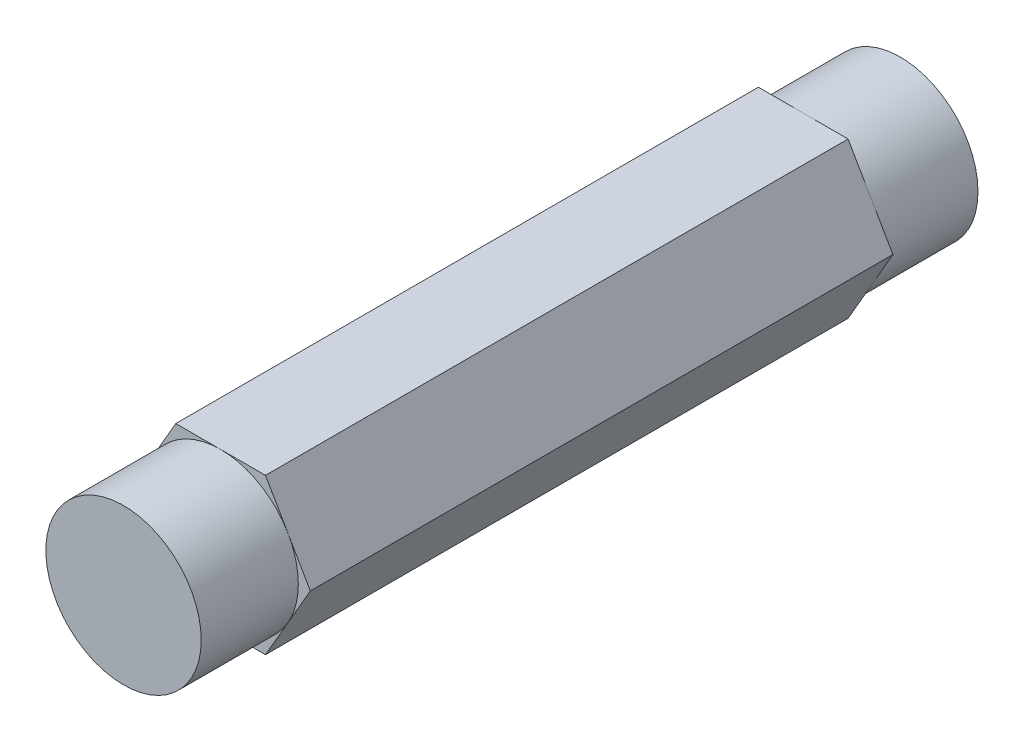
ISO-10303-21;
HEADER;
FILE_DESCRIPTION(('STEP AP214'),'2;1');
FILE_NAME('part.step','',(''),(''),'','','');
FILE_SCHEMA(('AUTOMOTIVE_DESIGN { 1 0 10303 214 1 1 1 1 }'));
ENDSEC;
DATA;
#1=APPLICATION_CONTEXT('core data for automotive mechanical design processes');
#2=APPLICATION_PROTOCOL_DEFINITION('international standard','automotive_design',2000,#1);
#3=PRODUCT_CONTEXT('',#1,'mechanical');
#4=PRODUCT('Part','Part','',(#3));
#5=PRODUCT_RELATED_PRODUCT_CATEGORY('part','',(#4));
#6=PRODUCT_DEFINITION_FORMATION('','',#4);
#7=PRODUCT_DEFINITION_CONTEXT('part definition',#1,'design');
#8=PRODUCT_DEFINITION('design','',#6,#7);
#9=PRODUCT_DEFINITION_SHAPE('','',#8);
#10=(LENGTH_UNIT() NAMED_UNIT(*) SI_UNIT(.MILLI.,.METRE.));
#11=(NAMED_UNIT(*) PLANE_ANGLE_UNIT() SI_UNIT($,.RADIAN.));
#12=(NAMED_UNIT(*) SI_UNIT($,.STERADIAN.) SOLID_ANGLE_UNIT());
#13=UNCERTAINTY_MEASURE_WITH_UNIT(LENGTH_MEASURE(1.E-05),#10,'distance_accuracy_value','');
#14=(GEOMETRIC_REPRESENTATION_CONTEXT(3) GLOBAL_UNCERTAINTY_ASSIGNED_CONTEXT((#13)) GLOBAL_UNIT_ASSIGNED_CONTEXT((#10,
#11,#12)) REPRESENTATION_CONTEXT('',''));
#15=CARTESIAN_POINT('',(0.,0.,0.));
#16=DIRECTION('',(0.,0.,1.));
#17=DIRECTION('',(1.,0.,0.));
#18=AXIS2_PLACEMENT_3D('',#15,#16,#17);
#19=CARTESIAN_POINT('',(3.66617420935418,-6.34999999999993,31.75));
#20=DIRECTION('',(-0.866025403784441,0.499999999999995,0.));
#21=DIRECTION('',(-0.499999999999995,-0.866025403784442,0.));
#22=AXIS2_PLACEMENT_3D('',#19,#20,#21);
#23=PLANE('',#22);
#24=DIRECTION('',(0.,0.,-1.));
#25=VECTOR('',#24,1.);
#26=CARTESIAN_POINT('',(3.66617420935418,-6.34999999999993,31.75));
#27=LINE('',#26,#25);
#28=CARTESIAN_POINT('',(3.66617420935418,-6.34999999999993,23.8125));
#29=VERTEX_POINT('',#28);
#30=CARTESIAN_POINT('',(3.66617420935418,-6.34999999999993,-23.8125));
#31=VERTEX_POINT('',#30);
#32=EDGE_CURVE('E200',#29,#31,#27,.T.);
#33=ORIENTED_EDGE('',*,*,#32,.T.);
#34=DIRECTION('',(0.499999999999995,0.866025403784442,0.));
#35=VECTOR('',#34,1.);
#36=CARTESIAN_POINT('',(3.66617420935418,-6.34999999999993,-23.8125));
#37=LINE('',#36,#35);
#38=CARTESIAN_POINT('',(5.49926131403117,-3.17499999999995,-23.8125));
#39=VERTEX_POINT('',#38);
#40=EDGE_CURVE('E63',#31,#39,#37,.T.);
#41=ORIENTED_EDGE('',*,*,#40,.T.);
#42=CARTESIAN_POINT('',(7.33234841870821,0.,-23.8125));
#43=VERTEX_POINT('',#42);
#44=EDGE_CURVE('E158',#39,#43,#37,.T.);
#45=ORIENTED_EDGE('',*,*,#44,.T.);
#46=DIRECTION('',(0.,0.,-1.));
#47=VECTOR('',#46,1.);
#48=CARTESIAN_POINT('',(7.33234841870821,0.,31.75));
#49=LINE('',#48,#47);
#50=CARTESIAN_POINT('',(7.33234841870821,0.,23.8125));
#51=VERTEX_POINT('',#50);
#52=EDGE_CURVE('E174',#51,#43,#49,.T.);
#53=ORIENTED_EDGE('',*,*,#52,.F.);
#54=DIRECTION('',(0.499999999999995,0.866025403784442,0.));
#55=VECTOR('',#54,1.);
#56=CARTESIAN_POINT('',(3.66617420935418,-6.34999999999993,23.8125));
#57=LINE('',#56,#55);
#58=CARTESIAN_POINT('',(5.49926131403117,-3.17499999999995,23.8125));
#59=VERTEX_POINT('',#58);
#60=EDGE_CURVE('E197',#59,#51,#57,.T.);
#61=ORIENTED_EDGE('',*,*,#60,.F.);
#62=EDGE_CURVE('E199',#29,#59,#57,.T.);
#63=ORIENTED_EDGE('',*,*,#62,.F.);
#64=EDGE_LOOP('',(#33,#41,#45,#53,#61,#63));
#65=FACE_BOUND('',#64,.T.);
#66=ADVANCED_FACE('F49',(#65),#23,.F.);
#67=CARTESIAN_POINT('',(7.33234841870821,0.,31.75));
#68=DIRECTION('',(-0.866025403784438,-0.500000000000001,0.));
#69=DIRECTION('',(0.500000000000001,-0.866025403784438,0.));
#70=AXIS2_PLACEMENT_3D('',#67,#68,#69);
#71=PLANE('',#70);
#72=ORIENTED_EDGE('',*,*,#52,.T.);
#73=DIRECTION('',(-0.500000000000001,0.866025403784438,0.));
#74=VECTOR('',#73,1.);
#75=CARTESIAN_POINT('',(7.33234841870821,0.,-23.8125));
#76=LINE('',#75,#74);
#77=CARTESIAN_POINT('',(5.49926131403115,3.17499999999999,-23.8125));
#78=VERTEX_POINT('',#77);
#79=EDGE_CURVE('E151',#43,#78,#76,.T.);
#80=ORIENTED_EDGE('',*,*,#79,.T.);
#81=CARTESIAN_POINT('',(3.66617420935409,6.34999999999998,-23.8125));
#82=VERTEX_POINT('',#81);
#83=EDGE_CURVE('E140',#78,#82,#76,.T.);
#84=ORIENTED_EDGE('',*,*,#83,.T.);
#85=DIRECTION('',(0.,0.,-1.));
#86=VECTOR('',#85,1.);
#87=CARTESIAN_POINT('',(3.66617420935409,6.34999999999998,31.75));
#88=LINE('',#87,#86);
#89=CARTESIAN_POINT('',(3.66617420935409,6.34999999999998,23.8125));
#90=VERTEX_POINT('',#89);
#91=EDGE_CURVE('E212',#90,#82,#88,.T.);
#92=ORIENTED_EDGE('',*,*,#91,.F.);
#93=DIRECTION('',(-0.500000000000001,0.866025403784438,0.));
#94=VECTOR('',#93,1.);
#95=CARTESIAN_POINT('',(7.33234841870821,0.,23.8125));
#96=LINE('',#95,#94);
#97=CARTESIAN_POINT('',(5.49926131403115,3.17499999999999,23.8125));
#98=VERTEX_POINT('',#97);
#99=EDGE_CURVE('E194',#98,#90,#96,.T.);
#100=ORIENTED_EDGE('',*,*,#99,.F.);
#101=EDGE_CURVE('E196',#51,#98,#96,.T.);
#102=ORIENTED_EDGE('',*,*,#101,.F.);
#103=EDGE_LOOP('',(#72,#80,#84,#92,#100,#102));
#104=FACE_BOUND('',#103,.T.);
#105=ADVANCED_FACE('F171',(#104),#71,.F.);
#106=CARTESIAN_POINT('',(3.66617420935409,6.34999999999998,31.75));
#107=DIRECTION('',(0.,-1.,0.));
#108=DIRECTION('',(1.,0.,0.));
#109=AXIS2_PLACEMENT_3D('',#106,#107,#108);
#110=PLANE('',#109);
#111=ORIENTED_EDGE('',*,*,#91,.T.);
#112=DIRECTION('',(-1.,0.,0.));
#113=VECTOR('',#112,1.);
#114=CARTESIAN_POINT('',(3.66617420935409,6.34999999999998,-23.8125));
#115=LINE('',#114,#113);
#116=CARTESIAN_POINT('',(0.,6.34999999999997,-23.8125));
#117=VERTEX_POINT('',#116);
#118=EDGE_CURVE('E146',#82,#117,#115,.T.);
#119=ORIENTED_EDGE('',*,*,#118,.T.);
#120=CARTESIAN_POINT('',(-3.66617420935413,6.34999999999995,-23.8125));
#121=VERTEX_POINT('',#120);
#122=EDGE_CURVE('E177',#117,#121,#115,.T.);
#123=ORIENTED_EDGE('',*,*,#122,.T.);
#124=DIRECTION('',(0.,0.,-1.));
#125=VECTOR('',#124,1.);
#126=CARTESIAN_POINT('',(-3.66617420935413,6.34999999999995,31.75));
#127=LINE('',#126,#125);
#128=CARTESIAN_POINT('',(-3.66617420935413,6.34999999999995,23.8125));
#129=VERTEX_POINT('',#128);
#130=EDGE_CURVE('E209',#129,#121,#127,.T.);
#131=ORIENTED_EDGE('',*,*,#130,.F.);
#132=DIRECTION('',(-1.,0.,0.));
#133=VECTOR('',#132,1.);
#134=CARTESIAN_POINT('',(3.66617420935409,6.34999999999998,23.8125));
#135=LINE('',#134,#133);
#136=CARTESIAN_POINT('',(0.,6.34999999999997,23.8125));
#137=VERTEX_POINT('',#136);
#138=EDGE_CURVE('E191',#137,#129,#135,.T.);
#139=ORIENTED_EDGE('',*,*,#138,.F.);
#140=EDGE_CURVE('E193',#90,#137,#135,.T.);
#141=ORIENTED_EDGE('',*,*,#140,.F.);
#142=EDGE_LOOP('',(#111,#119,#123,#131,#139,#141));
#143=FACE_BOUND('',#142,.T.);
#144=ADVANCED_FACE('F252',(#143),#110,.F.);
#145=CARTESIAN_POINT('',(-3.66617420935413,6.34999999999995,31.75));
#146=DIRECTION('',(0.866025403784442,-0.499999999999995,0.));
#147=DIRECTION('',(0.499999999999995,0.866025403784442,0.));
#148=AXIS2_PLACEMENT_3D('',#145,#146,#147);
#149=PLANE('',#148);
#150=ORIENTED_EDGE('',*,*,#130,.T.);
#151=DIRECTION('',(-0.499999999999995,-0.866025403784442,0.));
#152=VECTOR('',#151,1.);
#153=CARTESIAN_POINT('',(-3.66617420935413,6.34999999999995,-23.8125));
#154=LINE('',#153,#152);
#155=CARTESIAN_POINT('',(-5.49926131403117,3.17499999999995,-23.8125));
#156=VERTEX_POINT('',#155);
#157=EDGE_CURVE('E284',#121,#156,#154,.T.);
#158=ORIENTED_EDGE('',*,*,#157,.T.);
#159=CARTESIAN_POINT('',(-7.33234841870821,0.,-23.8125));
#160=VERTEX_POINT('',#159);
#161=EDGE_CURVE('E283',#156,#160,#154,.T.);
#162=ORIENTED_EDGE('',*,*,#161,.T.);
#163=DIRECTION('',(0.,0.,-1.));
#164=VECTOR('',#163,1.);
#165=CARTESIAN_POINT('',(-7.33234841870821,0.,31.75));
#166=LINE('',#165,#164);
#167=CARTESIAN_POINT('',(-7.33234841870821,0.,23.8125));
#168=VERTEX_POINT('',#167);
#169=EDGE_CURVE('E206',#168,#160,#166,.T.);
#170=ORIENTED_EDGE('',*,*,#169,.F.);
#171=DIRECTION('',(-0.499999999999995,-0.866025403784442,0.));
#172=VECTOR('',#171,1.);
#173=CARTESIAN_POINT('',(-3.66617420935413,6.34999999999995,23.8125));
#174=LINE('',#173,#172);
#175=CARTESIAN_POINT('',(-5.49926131403117,3.17499999999995,23.8125));
#176=VERTEX_POINT('',#175);
#177=EDGE_CURVE('E188',#176,#168,#174,.T.);
#178=ORIENTED_EDGE('',*,*,#177,.F.);
#179=EDGE_CURVE('E190',#129,#176,#174,.T.);
#180=ORIENTED_EDGE('',*,*,#179,.F.);
#181=EDGE_LOOP('',(#150,#158,#162,#170,#178,#180));
#182=FACE_BOUND('',#181,.T.);
#183=ADVANCED_FACE('F262',(#182),#149,.F.);
#184=CARTESIAN_POINT('',(-7.33234841870821,0.,31.75));
#185=DIRECTION('',(0.866025403784435,0.500000000000007,0.));
#186=DIRECTION('',(-0.500000000000007,0.866025403784435,0.));
#187=AXIS2_PLACEMENT_3D('',#184,#185,#186);
#188=PLANE('',#187);
#189=ORIENTED_EDGE('',*,*,#169,.T.);
#190=DIRECTION('',(0.500000000000007,-0.866025403784435,0.));
#191=VECTOR('',#190,1.);
#192=CARTESIAN_POINT('',(-7.33234841870821,0.,-23.8125));
#193=LINE('',#192,#191);
#194=CARTESIAN_POINT('',(-5.49926131403113,-3.17500000000003,-23.8125));
#195=VERTEX_POINT('',#194);
#196=EDGE_CURVE('E282',#160,#195,#193,.T.);
#197=ORIENTED_EDGE('',*,*,#196,.T.);
#198=CARTESIAN_POINT('',(-3.66617420935405,-6.35,-23.8125));
#199=VERTEX_POINT('',#198);
#200=EDGE_CURVE('E169',#195,#199,#193,.T.);
#201=ORIENTED_EDGE('',*,*,#200,.T.);
#202=DIRECTION('',(0.,0.,-1.));
#203=VECTOR('',#202,1.);
#204=CARTESIAN_POINT('',(-3.66617420935405,-6.35,31.75));
#205=LINE('',#204,#203);
#206=CARTESIAN_POINT('',(-3.66617420935405,-6.35,23.8125));
#207=VERTEX_POINT('',#206);
#208=EDGE_CURVE('E203',#207,#199,#205,.T.);
#209=ORIENTED_EDGE('',*,*,#208,.F.);
#210=DIRECTION('',(0.500000000000007,-0.866025403784435,0.));
#211=VECTOR('',#210,1.);
#212=CARTESIAN_POINT('',(-7.33234841870821,0.,23.8125));
#213=LINE('',#212,#211);
#214=CARTESIAN_POINT('',(-5.49926131403113,-3.17500000000003,23.8125));
#215=VERTEX_POINT('',#214);
#216=EDGE_CURVE('E183',#215,#207,#213,.T.);
#217=ORIENTED_EDGE('',*,*,#216,.F.);
#218=EDGE_CURVE('E187',#168,#215,#213,.T.);
#219=ORIENTED_EDGE('',*,*,#218,.F.);
#220=EDGE_LOOP('',(#189,#197,#201,#209,#217,#219));
#221=FACE_BOUND('',#220,.T.);
#222=ADVANCED_FACE('F271',(#221),#188,.F.);
#223=CARTESIAN_POINT('',(-3.66617420935405,-6.35,31.75));
#224=DIRECTION('',(0.,1.,0.));
#225=DIRECTION('',(-1.,0.,0.));
#226=AXIS2_PLACEMENT_3D('',#223,#224,#225);
#227=PLANE('',#226);
#228=ORIENTED_EDGE('',*,*,#208,.T.);
#229=DIRECTION('',(1.,0.,0.));
#230=VECTOR('',#229,1.);
#231=CARTESIAN_POINT('',(-3.66617420935405,-6.35,-23.8125));
#232=LINE('',#231,#230);
#233=CARTESIAN_POINT('',(0.,-6.34999999999997,-23.8125));
#234=VERTEX_POINT('',#233);
#235=EDGE_CURVE('E12',#199,#234,#232,.T.);
#236=ORIENTED_EDGE('',*,*,#235,.T.);
#237=EDGE_CURVE('E52',#234,#31,#232,.T.);
#238=ORIENTED_EDGE('',*,*,#237,.T.);
#239=ORIENTED_EDGE('',*,*,#32,.F.);
#240=DIRECTION('',(1.,0.,0.));
#241=VECTOR('',#240,1.);
#242=CARTESIAN_POINT('',(-3.66617420935405,-6.35,23.8125));
#243=LINE('',#242,#241);
#244=CARTESIAN_POINT('',(0.,-6.34999999999996,23.8125));
#245=VERTEX_POINT('',#244);
#246=EDGE_CURVE('E218',#245,#29,#243,.T.);
#247=ORIENTED_EDGE('',*,*,#246,.F.);
#248=EDGE_CURVE('E219',#207,#245,#243,.T.);
#249=ORIENTED_EDGE('',*,*,#248,.F.);
#250=EDGE_LOOP('',(#228,#236,#238,#239,#247,#249));
#251=FACE_BOUND('',#250,.T.);
#252=ADVANCED_FACE('F233',(#251),#227,.F.);
#253=CARTESIAN_POINT('',(0.,0.,23.8125));
#254=DIRECTION('',(0.,0.,1.));
#255=DIRECTION('',(1.,0.,0.));
#256=AXIS2_PLACEMENT_3D('',#253,#254,#255);
#257=PLANE('',#256);
#258=ORIENTED_EDGE('',*,*,#62,.T.);
#259=CARTESIAN_POINT('',(0.,0.,23.8125));
#260=DIRECTION('',(0.,0.,1.));
#261=DIRECTION('',(1.,0.,0.));
#262=AXIS2_PLACEMENT_3D('',#259,#260,#261);
#263=CIRCLE('',#262,6.34999999999997);
#264=EDGE_CURVE('E238',#245,#59,#263,.T.);
#265=ORIENTED_EDGE('',*,*,#264,.F.);
#266=ORIENTED_EDGE('',*,*,#246,.T.);
#267=EDGE_LOOP('',(#258,#265,#266));
#268=FACE_BOUND('',#267,.T.);
#269=ADVANCED_FACE('F236',(#268),#257,.T.);
#270=ORIENTED_EDGE('',*,*,#60,.T.);
#271=ORIENTED_EDGE('',*,*,#101,.T.);
#272=EDGE_CURVE('E185',#59,#98,#263,.T.);
#273=ORIENTED_EDGE('',*,*,#272,.F.);
#274=EDGE_LOOP('',(#270,#271,#273));
#275=FACE_BOUND('',#274,.T.);
#276=ADVANCED_FACE('F242',(#275),#257,.T.);
#277=ORIENTED_EDGE('',*,*,#99,.T.);
#278=ORIENTED_EDGE('',*,*,#140,.T.);
#279=EDGE_CURVE('E180',#98,#137,#263,.T.);
#280=ORIENTED_EDGE('',*,*,#279,.F.);
#281=EDGE_LOOP('',(#277,#278,#280));
#282=FACE_BOUND('',#281,.T.);
#283=ADVANCED_FACE('F248',(#282),#257,.T.);
#284=ORIENTED_EDGE('',*,*,#138,.T.);
#285=ORIENTED_EDGE('',*,*,#179,.T.);
#286=EDGE_CURVE('E184',#137,#176,#263,.T.);
#287=ORIENTED_EDGE('',*,*,#286,.F.);
#288=EDGE_LOOP('',(#284,#285,#287));
#289=FACE_BOUND('',#288,.T.);
#290=ADVANCED_FACE('F257',(#289),#257,.T.);
#291=ORIENTED_EDGE('',*,*,#177,.T.);
#292=ORIENTED_EDGE('',*,*,#218,.T.);
#293=EDGE_CURVE('E269',#176,#215,#263,.T.);
#294=ORIENTED_EDGE('',*,*,#293,.F.);
#295=EDGE_LOOP('',(#291,#292,#294));
#296=FACE_BOUND('',#295,.T.);
#297=ADVANCED_FACE('F268',(#296),#257,.T.);
#298=ORIENTED_EDGE('',*,*,#216,.T.);
#299=ORIENTED_EDGE('',*,*,#248,.T.);
#300=EDGE_CURVE('E71',#215,#245,#263,.T.);
#301=ORIENTED_EDGE('',*,*,#300,.F.);
#302=EDGE_LOOP('',(#298,#299,#301));
#303=FACE_BOUND('',#302,.T.);
#304=ADVANCED_FACE('F228',(#303),#257,.T.);
#305=CARTESIAN_POINT('',(0.,0.,23.8125));
#306=DIRECTION('',(0.,0.,1.));
#307=DIRECTION('',(1.,0.,0.));
#308=AXIS2_PLACEMENT_3D('',#305,#306,#307);
#309=CYLINDRICAL_SURFACE('',#308,6.34999999999997);
#310=CARTESIAN_POINT('',(0.,0.,31.75));
#311=DIRECTION('',(0.,0.,1.));
#312=DIRECTION('',(1.,0.,0.));
#313=AXIS2_PLACEMENT_3D('',#310,#311,#312);
#314=CIRCLE('',#313,6.34999999999997);
#315=CARTESIAN_POINT('',(6.34999999999997,0.,31.75));
#316=VERTEX_POINT('',#315);
#317=EDGE_CURVE('E215',#316,#316,#314,.T.);
#318=ORIENTED_EDGE('',*,*,#317,.F.);
#319=EDGE_LOOP('',(#318));
#320=FACE_BOUND('',#319,.T.);
#321=ORIENTED_EDGE('',*,*,#264,.T.);
#322=ORIENTED_EDGE('',*,*,#272,.T.);
#323=ORIENTED_EDGE('',*,*,#279,.T.);
#324=ORIENTED_EDGE('',*,*,#286,.T.);
#325=ORIENTED_EDGE('',*,*,#293,.T.);
#326=ORIENTED_EDGE('',*,*,#300,.T.);
#327=EDGE_LOOP('',(#321,#322,#323,#324,#325,#326));
#328=FACE_BOUND('',#327,.T.);
#329=ADVANCED_FACE('F319',(#320,#328),#309,.T.);
#330=CARTESIAN_POINT('',(0.,0.,31.75));
#331=DIRECTION('',(0.,0.,1.));
#332=DIRECTION('',(1.,0.,0.));
#333=AXIS2_PLACEMENT_3D('',#330,#331,#332);
#334=PLANE('',#333);
#335=ORIENTED_EDGE('',*,*,#317,.T.);
#336=EDGE_LOOP('',(#335));
#337=FACE_BOUND('',#336,.T.);
#338=ADVANCED_FACE('F316',(#337),#334,.T.);
#339=CARTESIAN_POINT('',(0.,0.,-23.8125));
#340=DIRECTION('',(0.,0.,1.));
#341=DIRECTION('',(1.,0.,0.));
#342=AXIS2_PLACEMENT_3D('',#339,#340,#341);
#343=PLANE('',#342);
#344=ORIENTED_EDGE('',*,*,#237,.F.);
#345=CARTESIAN_POINT('',(0.,0.,-23.8125));
#346=DIRECTION('',(0.,0.,1.));
#347=DIRECTION('',(1.,0.,0.));
#348=AXIS2_PLACEMENT_3D('',#345,#346,#347);
#349=CIRCLE('',#348,6.34999999999997);
#350=EDGE_CURVE('E161',#234,#39,#349,.T.);
#351=ORIENTED_EDGE('',*,*,#350,.T.);
#352=ORIENTED_EDGE('',*,*,#40,.F.);
#353=EDGE_LOOP('',(#344,#351,#352));
#354=FACE_BOUND('',#353,.T.);
#355=ADVANCED_FACE('F295',(#354),#343,.F.);
#356=EDGE_CURVE('E155',#39,#78,#349,.T.);
#357=ORIENTED_EDGE('',*,*,#356,.T.);
#358=ORIENTED_EDGE('',*,*,#79,.F.);
#359=ORIENTED_EDGE('',*,*,#44,.F.);
#360=EDGE_LOOP('',(#357,#358,#359));
#361=FACE_BOUND('',#360,.T.);
#362=ADVANCED_FACE('F156',(#361),#343,.F.);
#363=EDGE_CURVE('E144',#78,#117,#349,.T.);
#364=ORIENTED_EDGE('',*,*,#363,.T.);
#365=ORIENTED_EDGE('',*,*,#118,.F.);
#366=ORIENTED_EDGE('',*,*,#83,.F.);
#367=EDGE_LOOP('',(#364,#365,#366));
#368=FACE_BOUND('',#367,.T.);
#369=ADVANCED_FACE('F142',(#368),#343,.F.);
#370=EDGE_CURVE('E168',#117,#156,#349,.T.);
#371=ORIENTED_EDGE('',*,*,#370,.T.);
#372=ORIENTED_EDGE('',*,*,#157,.F.);
#373=ORIENTED_EDGE('',*,*,#122,.F.);
#374=EDGE_LOOP('',(#371,#372,#373));
#375=FACE_BOUND('',#374,.T.);
#376=ADVANCED_FACE('F288',(#375),#343,.F.);
#377=EDGE_CURVE('E280',#156,#195,#349,.T.);
#378=ORIENTED_EDGE('',*,*,#377,.T.);
#379=ORIENTED_EDGE('',*,*,#196,.F.);
#380=ORIENTED_EDGE('',*,*,#161,.F.);
#381=EDGE_LOOP('',(#378,#379,#380));
#382=FACE_BOUND('',#381,.T.);
#383=ADVANCED_FACE('F286',(#382),#343,.F.);
#384=EDGE_CURVE('E278',#195,#234,#349,.T.);
#385=ORIENTED_EDGE('',*,*,#384,.T.);
#386=ORIENTED_EDGE('',*,*,#235,.F.);
#387=ORIENTED_EDGE('',*,*,#200,.F.);
#388=EDGE_LOOP('',(#385,#386,#387));
#389=FACE_BOUND('',#388,.T.);
#390=ADVANCED_FACE('F276',(#389),#343,.F.);
#391=CARTESIAN_POINT('',(0.,0.,-23.8125));
#392=DIRECTION('',(0.,0.,-1.));
#393=DIRECTION('',(-1.,0.,0.));
#394=AXIS2_PLACEMENT_3D('',#391,#392,#393);
#395=CYLINDRICAL_SURFACE('',#394,6.34999999999997);
#396=ORIENTED_EDGE('',*,*,#356,.F.);
#397=ORIENTED_EDGE('',*,*,#350,.F.);
#398=ORIENTED_EDGE('',*,*,#384,.F.);
#399=ORIENTED_EDGE('',*,*,#377,.F.);
#400=ORIENTED_EDGE('',*,*,#370,.F.);
#401=ORIENTED_EDGE('',*,*,#363,.F.);
#402=EDGE_LOOP('',(#396,#397,#398,#399,#400,#401));
#403=FACE_BOUND('',#402,.T.);
#404=CARTESIAN_POINT('',(0.,0.,-31.75));
#405=DIRECTION('',(0.,0.,1.));
#406=DIRECTION('',(1.,0.,0.));
#407=AXIS2_PLACEMENT_3D('',#404,#405,#406);
#408=CIRCLE('',#407,6.34999999999997);
#409=CARTESIAN_POINT('',(6.34999999999997,0.,-31.75));
#410=VERTEX_POINT('',#409);
#411=EDGE_CURVE('E220',#410,#410,#408,.F.);
#412=ORIENTED_EDGE('',*,*,#411,.F.);
#413=EDGE_LOOP('',(#412));
#414=FACE_BOUND('',#413,.T.);
#415=ADVANCED_FACE('F164',(#403,#414),#395,.T.);
#416=CARTESIAN_POINT('',(0.,0.,-31.75));
#417=DIRECTION('',(0.,0.,1.));
#418=DIRECTION('',(1.,0.,0.));
#419=AXIS2_PLACEMENT_3D('',#416,#417,#418);
#420=PLANE('',#419);
#421=ORIENTED_EDGE('',*,*,#411,.T.);
#422=EDGE_LOOP('',(#421));
#423=FACE_BOUND('',#422,.T.);
#424=ADVANCED_FACE('F313',(#423),#420,.F.);
#425=CLOSED_SHELL('',(#66,#105,#144,#183,#222,#252,#269,#276,#283,#290,#297,#304,#329,#338,#355,
#362,#369,#376,#383,#390,#415,#424));
#426=MANIFOLD_SOLID_BREP('B2',#425);
#427=ADVANCED_BREP_SHAPE_REPRESENTATION('',(#18,#426),#14);
#428=SHAPE_DEFINITION_REPRESENTATION(#9,#427);
ENDSEC;
END-ISO-10303-21;
